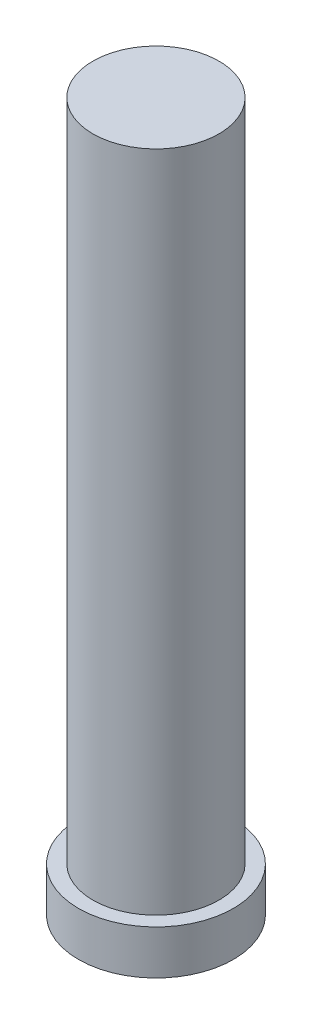
ISO-10303-21;
HEADER;
FILE_DESCRIPTION(('STEP AP214'),'2;1');
FILE_NAME('part.step','',(''),(''),'','','');
FILE_SCHEMA(('AUTOMOTIVE_DESIGN { 1 0 10303 214 1 1 1 1 }'));
ENDSEC;
DATA;
#1=APPLICATION_CONTEXT('core data for automotive mechanical design processes');
#2=APPLICATION_PROTOCOL_DEFINITION('international standard','automotive_design',2000,#1);
#3=PRODUCT_CONTEXT('',#1,'mechanical');
#4=PRODUCT('Part','Part','',(#3));
#5=PRODUCT_RELATED_PRODUCT_CATEGORY('part','',(#4));
#6=PRODUCT_DEFINITION_FORMATION('','',#4);
#7=PRODUCT_DEFINITION_CONTEXT('part definition',#1,'design');
#8=PRODUCT_DEFINITION('design','',#6,#7);
#9=PRODUCT_DEFINITION_SHAPE('','',#8);
#10=(LENGTH_UNIT() NAMED_UNIT(*) SI_UNIT(.MILLI.,.METRE.));
#11=(NAMED_UNIT(*) PLANE_ANGLE_UNIT() SI_UNIT($,.RADIAN.));
#12=(NAMED_UNIT(*) SI_UNIT($,.STERADIAN.) SOLID_ANGLE_UNIT());
#13=UNCERTAINTY_MEASURE_WITH_UNIT(LENGTH_MEASURE(1.E-05),#10,'distance_accuracy_value','');
#14=(GEOMETRIC_REPRESENTATION_CONTEXT(3) GLOBAL_UNCERTAINTY_ASSIGNED_CONTEXT((#13)) GLOBAL_UNIT_ASSIGNED_CONTEXT((#10,
#11,#12)) REPRESENTATION_CONTEXT('',''));
#15=CARTESIAN_POINT('',(0.,0.,0.));
#16=DIRECTION('',(0.,0.,1.));
#17=DIRECTION('',(1.,0.,0.));
#18=AXIS2_PLACEMENT_3D('',#15,#16,#17);
#19=CARTESIAN_POINT('',(0.,2.,0.));
#20=DIRECTION('',(0.,-1.,0.));
#21=DIRECTION('',(0.,0.,-1.));
#22=AXIS2_PLACEMENT_3D('',#19,#20,#21);
#23=CYLINDRICAL_SURFACE('',#22,3.5);
#24=CARTESIAN_POINT('',(0.,2.,0.));
#25=DIRECTION('',(0.,1.,0.));
#26=DIRECTION('',(0.,0.,1.));
#27=AXIS2_PLACEMENT_3D('',#24,#25,#26);
#28=CIRCLE('',#27,3.5);
#29=CARTESIAN_POINT('',(0.,2.,3.5));
#30=VERTEX_POINT('',#29);
#31=EDGE_CURVE('E45',#30,#30,#28,.T.);
#32=ORIENTED_EDGE('',*,*,#31,.F.);
#33=EDGE_LOOP('',(#32));
#34=FACE_BOUND('',#33,.T.);
#35=CARTESIAN_POINT('',(0.,0.,0.));
#36=DIRECTION('',(0.,1.,0.));
#37=DIRECTION('',(0.,0.,1.));
#38=AXIS2_PLACEMENT_3D('',#35,#36,#37);
#39=CIRCLE('',#38,3.5);
#40=CARTESIAN_POINT('',(0.,0.,3.5));
#41=VERTEX_POINT('',#40);
#42=EDGE_CURVE('E40',#41,#41,#39,.T.);
#43=ORIENTED_EDGE('',*,*,#42,.T.);
#44=EDGE_LOOP('',(#43));
#45=FACE_BOUND('',#44,.T.);
#46=ADVANCED_FACE('F37',(#34,#45),#23,.T.);
#47=CARTESIAN_POINT('',(0.,2.,0.));
#48=DIRECTION('',(0.,1.,0.));
#49=DIRECTION('',(0.,0.,1.));
#50=AXIS2_PLACEMENT_3D('',#47,#48,#49);
#51=PLANE('',#50);
#52=CARTESIAN_POINT('',(0.,2.,0.));
#53=DIRECTION('',(0.,1.,0.));
#54=DIRECTION('',(0.,0.,1.));
#55=AXIS2_PLACEMENT_3D('',#52,#53,#54);
#56=CIRCLE('',#55,2.85);
#57=CARTESIAN_POINT('',(0.,2.,2.85));
#58=VERTEX_POINT('',#57);
#59=EDGE_CURVE('E10',#58,#58,#56,.T.);
#60=ORIENTED_EDGE('',*,*,#59,.F.);
#61=EDGE_LOOP('',(#60));
#62=FACE_BOUND('',#61,.T.);
#63=ORIENTED_EDGE('',*,*,#31,.T.);
#64=EDGE_LOOP('',(#63));
#65=FACE_BOUND('',#64,.T.);
#66=ADVANCED_FACE('F65',(#62,#65),#51,.T.);
#67=CARTESIAN_POINT('',(0.,0.,0.));
#68=DIRECTION('',(0.,1.,0.));
#69=DIRECTION('',(0.,0.,1.));
#70=AXIS2_PLACEMENT_3D('',#67,#68,#69);
#71=PLANE('',#70);
#72=ORIENTED_EDGE('',*,*,#42,.F.);
#73=EDGE_LOOP('',(#72));
#74=FACE_BOUND('',#73,.T.);
#75=ADVANCED_FACE('F62',(#74),#71,.F.);
#76=CARTESIAN_POINT('',(0.,32.,0.));
#77=DIRECTION('',(0.,-1.,0.));
#78=DIRECTION('',(0.,0.,-1.));
#79=AXIS2_PLACEMENT_3D('',#76,#77,#78);
#80=CYLINDRICAL_SURFACE('',#79,2.85);
#81=CARTESIAN_POINT('',(0.,32.,0.));
#82=DIRECTION('',(0.,1.,0.));
#83=DIRECTION('',(0.,0.,1.));
#84=AXIS2_PLACEMENT_3D('',#81,#82,#83);
#85=CIRCLE('',#84,2.85);
#86=CARTESIAN_POINT('',(0.,32.,2.85));
#87=VERTEX_POINT('',#86);
#88=EDGE_CURVE('E52',#87,#87,#85,.T.);
#89=ORIENTED_EDGE('',*,*,#88,.F.);
#90=EDGE_LOOP('',(#89));
#91=FACE_BOUND('',#90,.T.);
#92=ORIENTED_EDGE('',*,*,#59,.T.);
#93=EDGE_LOOP('',(#92));
#94=FACE_BOUND('',#93,.T.);
#95=ADVANCED_FACE('F64',(#91,#94),#80,.T.);
#96=CARTESIAN_POINT('',(0.,32.,0.));
#97=DIRECTION('',(0.,1.,0.));
#98=DIRECTION('',(0.,0.,1.));
#99=AXIS2_PLACEMENT_3D('',#96,#97,#98);
#100=PLANE('',#99);
#101=ORIENTED_EDGE('',*,*,#88,.T.);
#102=EDGE_LOOP('',(#101));
#103=FACE_BOUND('',#102,.T.);
#104=ADVANCED_FACE('F70',(#103),#100,.T.);
#105=CLOSED_SHELL('',(#46,#66,#75,#95,#104));
#106=MANIFOLD_SOLID_BREP('B2',#105);
#107=ADVANCED_BREP_SHAPE_REPRESENTATION('',(#18,#106),#14);
#108=SHAPE_DEFINITION_REPRESENTATION(#9,#107);
ENDSEC;
END-ISO-10303-21;
